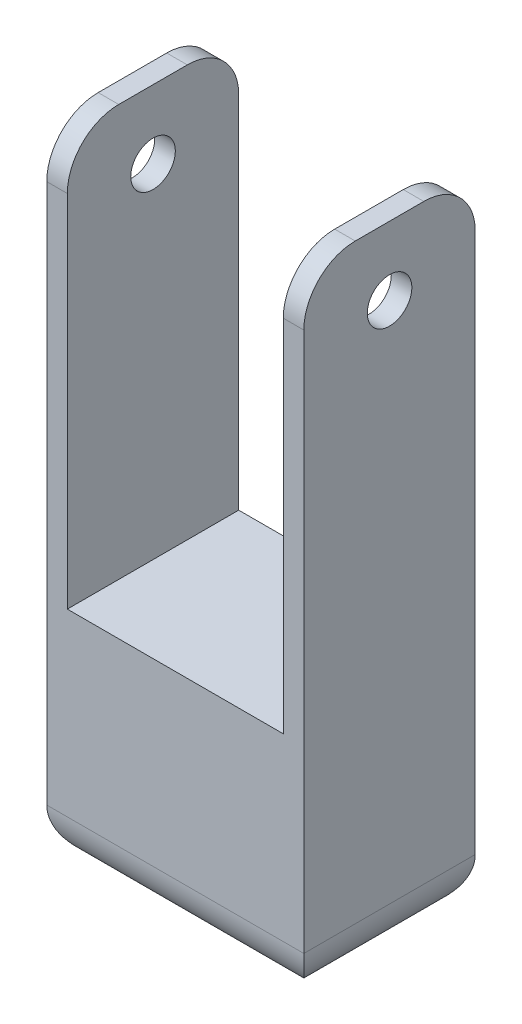
ISO-10303-21;
HEADER;
FILE_DESCRIPTION(('STEP AP214'),'2;1');
FILE_NAME('part.step','',(''),(''),'','','');
FILE_SCHEMA(('AUTOMOTIVE_DESIGN { 1 0 10303 214 1 1 1 1 }'));
ENDSEC;
DATA;
#1=APPLICATION_CONTEXT('core data for automotive mechanical design processes');
#2=APPLICATION_PROTOCOL_DEFINITION('international standard','automotive_design',2000,#1);
#3=PRODUCT_CONTEXT('',#1,'mechanical');
#4=PRODUCT('Part','Part','',(#3));
#5=PRODUCT_RELATED_PRODUCT_CATEGORY('part','',(#4));
#6=PRODUCT_DEFINITION_FORMATION('','',#4);
#7=PRODUCT_DEFINITION_CONTEXT('part definition',#1,'design');
#8=PRODUCT_DEFINITION('design','',#6,#7);
#9=PRODUCT_DEFINITION_SHAPE('','',#8);
#10=(LENGTH_UNIT() NAMED_UNIT(*) SI_UNIT(.MILLI.,.METRE.));
#11=(NAMED_UNIT(*) PLANE_ANGLE_UNIT() SI_UNIT($,.RADIAN.));
#12=(NAMED_UNIT(*) SI_UNIT($,.STERADIAN.) SOLID_ANGLE_UNIT());
#13=UNCERTAINTY_MEASURE_WITH_UNIT(LENGTH_MEASURE(1.E-05),#10,'distance_accuracy_value','');
#14=(GEOMETRIC_REPRESENTATION_CONTEXT(3) GLOBAL_UNCERTAINTY_ASSIGNED_CONTEXT((#13)) GLOBAL_UNIT_ASSIGNED_CONTEXT((#10,
#11,#12)) REPRESENTATION_CONTEXT('',''));
#15=CARTESIAN_POINT('',(0.,0.,0.));
#16=DIRECTION('',(0.,0.,1.));
#17=DIRECTION('',(1.,0.,0.));
#18=AXIS2_PLACEMENT_3D('',#15,#16,#17);
#19=CARTESIAN_POINT('',(0.,63.5,0.));
#20=DIRECTION('',(0.,1.,0.));
#21=DIRECTION('',(0.,0.,1.));
#22=AXIS2_PLACEMENT_3D('',#19,#20,#21);
#23=PLANE('',#22);
#24=DIRECTION('',(0.,0.,1.));
#25=VECTOR('',#24,1.);
#26=CARTESIAN_POINT('',(-19.05,63.5,-12.7));
#27=LINE('',#26,#25);
#28=CARTESIAN_POINT('',(-19.05,63.5,-5.08));
#29=VERTEX_POINT('',#28);
#30=CARTESIAN_POINT('',(-19.05,63.5,5.07999999999999));
#31=VERTEX_POINT('',#30);
#32=EDGE_CURVE('E187',#29,#31,#27,.T.);
#33=ORIENTED_EDGE('',*,*,#32,.T.);
#34=DIRECTION('',(1.,0.,0.));
#35=VECTOR('',#34,1.);
#36=CARTESIAN_POINT('',(-16.002,63.5,5.08));
#37=LINE('',#36,#35);
#38=CARTESIAN_POINT('',(-16.002,63.5,5.07999999999999));
#39=VERTEX_POINT('',#38);
#40=EDGE_CURVE('E227',#31,#39,#37,.T.);
#41=ORIENTED_EDGE('',*,*,#40,.T.);
#42=DIRECTION('',(0.,0.,1.));
#43=VECTOR('',#42,1.);
#44=CARTESIAN_POINT('',(-16.002,63.5,-12.7));
#45=LINE('',#44,#43);
#46=CARTESIAN_POINT('',(-16.002,63.5,-5.08));
#47=VERTEX_POINT('',#46);
#48=EDGE_CURVE('E173',#47,#39,#45,.T.);
#49=ORIENTED_EDGE('',*,*,#48,.F.);
#50=DIRECTION('',(-1.,0.,0.));
#51=VECTOR('',#50,1.);
#52=CARTESIAN_POINT('',(-19.05,63.5,-5.08));
#53=LINE('',#52,#51);
#54=EDGE_CURVE('E224',#47,#29,#53,.T.);
#55=ORIENTED_EDGE('',*,*,#54,.T.);
#56=EDGE_LOOP('',(#33,#41,#49,#55));
#57=FACE_BOUND('',#56,.T.);
#58=ADVANCED_FACE('F37',(#57),#23,.T.);
#59=CARTESIAN_POINT('',(19.05,63.5,-12.7));
#60=DIRECTION('',(-1.,0.,0.));
#61=DIRECTION('',(0.,0.,1.));
#62=AXIS2_PLACEMENT_3D('',#59,#60,#61);
#63=PLANE('',#62);
#64=CARTESIAN_POINT('',(19.05,53.34,0.));
#65=DIRECTION('',(-1.,0.,0.));
#66=DIRECTION('',(0.,0.,1.));
#67=AXIS2_PLACEMENT_3D('',#64,#65,#66);
#68=CIRCLE('',#67,3.302);
#69=CARTESIAN_POINT('',(19.05,53.34,3.302));
#70=VERTEX_POINT('',#69);
#71=EDGE_CURVE('E202',#70,#70,#68,.T.);
#72=ORIENTED_EDGE('',*,*,#71,.T.);
#73=EDGE_LOOP('',(#72));
#74=FACE_BOUND('',#73,.T.);
#75=DIRECTION('',(0.,-1.,0.));
#76=VECTOR('',#75,1.);
#77=CARTESIAN_POINT('',(19.05,63.5,12.7));
#78=LINE('',#77,#76);
#79=CARTESIAN_POINT('',(19.05,55.88,12.7));
#80=VERTEX_POINT('',#79);
#81=CARTESIAN_POINT('',(19.05,-24.13,12.7));
#82=VERTEX_POINT('',#81);
#83=EDGE_CURVE('E190',#80,#82,#78,.T.);
#84=ORIENTED_EDGE('',*,*,#83,.T.);
#85=DIRECTION('',(0.,0.,1.));
#86=VECTOR('',#85,1.);
#87=CARTESIAN_POINT('',(19.05,-24.13,-12.7));
#88=LINE('',#87,#86);
#89=CARTESIAN_POINT('',(19.05,-24.13,-12.7));
#90=VERTEX_POINT('',#89);
#91=EDGE_CURVE('E61',#82,#90,#88,.F.);
#92=ORIENTED_EDGE('',*,*,#91,.T.);
#93=DIRECTION('',(0.,-1.,0.));
#94=VECTOR('',#93,1.);
#95=CARTESIAN_POINT('',(19.05,63.5,-12.7));
#96=LINE('',#95,#94);
#97=CARTESIAN_POINT('',(19.05,55.88,-12.7));
#98=VERTEX_POINT('',#97);
#99=EDGE_CURVE('E196',#98,#90,#96,.T.);
#100=ORIENTED_EDGE('',*,*,#99,.F.);
#101=CARTESIAN_POINT('',(19.05,55.88,-5.08));
#102=DIRECTION('',(-1.,0.,0.));
#103=DIRECTION('',(0.,0.,1.));
#104=AXIS2_PLACEMENT_3D('',#101,#102,#103);
#105=CIRCLE('',#104,7.62);
#106=CARTESIAN_POINT('',(19.05,63.5,-5.08));
#107=VERTEX_POINT('',#106);
#108=EDGE_CURVE('E208',#98,#107,#105,.F.);
#109=ORIENTED_EDGE('',*,*,#108,.T.);
#110=DIRECTION('',(0.,0.,-1.));
#111=VECTOR('',#110,1.);
#112=CARTESIAN_POINT('',(19.05,63.5,-12.7));
#113=LINE('',#112,#111);
#114=CARTESIAN_POINT('',(19.05,63.5,5.07999999999999));
#115=VERTEX_POINT('',#114);
#116=EDGE_CURVE('E180',#115,#107,#113,.T.);
#117=ORIENTED_EDGE('',*,*,#116,.F.);
#118=CARTESIAN_POINT('',(19.05,55.88,5.08));
#119=DIRECTION('',(-1.,0.,0.));
#120=DIRECTION('',(0.,0.,1.));
#121=AXIS2_PLACEMENT_3D('',#118,#119,#120);
#122=CIRCLE('',#121,7.62);
#123=EDGE_CURVE('E210',#115,#80,#122,.F.);
#124=ORIENTED_EDGE('',*,*,#123,.T.);
#125=EDGE_LOOP('',(#84,#92,#100,#109,#117,#124));
#126=FACE_BOUND('',#125,.T.);
#127=ADVANCED_FACE('F291',(#74,#126),#63,.F.);
#128=CARTESIAN_POINT('',(-19.05,63.5,-12.7));
#129=DIRECTION('',(0.,0.,1.));
#130=DIRECTION('',(1.,0.,0.));
#131=AXIS2_PLACEMENT_3D('',#128,#129,#130);
#132=PLANE('',#131);
#133=ORIENTED_EDGE('',*,*,#99,.T.);
#134=DIRECTION('',(1.,0.,0.));
#135=VECTOR('',#134,1.);
#136=CARTESIAN_POINT('',(-19.05,-24.13,-12.7));
#137=LINE('',#136,#135);
#138=CARTESIAN_POINT('',(-19.05,-24.13,-12.7));
#139=VERTEX_POINT('',#138);
#140=EDGE_CURVE('E46',#90,#139,#137,.F.);
#141=ORIENTED_EDGE('',*,*,#140,.T.);
#142=DIRECTION('',(0.,-1.,0.));
#143=VECTOR('',#142,1.);
#144=CARTESIAN_POINT('',(-19.05,63.5,-12.7));
#145=LINE('',#144,#143);
#146=CARTESIAN_POINT('',(-19.05,55.88,-12.7));
#147=VERTEX_POINT('',#146);
#148=EDGE_CURVE('E194',#147,#139,#145,.T.);
#149=ORIENTED_EDGE('',*,*,#148,.F.);
#150=DIRECTION('',(-1.,0.,0.));
#151=VECTOR('',#150,1.);
#152=CARTESIAN_POINT('',(-16.002,55.88,-12.7));
#153=LINE('',#152,#151);
#154=CARTESIAN_POINT('',(-16.002,55.88,-12.7));
#155=VERTEX_POINT('',#154);
#156=EDGE_CURVE('E220',#147,#155,#153,.F.);
#157=ORIENTED_EDGE('',*,*,#156,.T.);
#158=DIRECTION('',(0.,1.,0.));
#159=VECTOR('',#158,1.);
#160=CARTESIAN_POINT('',(-16.002,2.53999999999999,-12.7));
#161=LINE('',#160,#159);
#162=CARTESIAN_POINT('',(-16.002,2.53999999999999,-12.7));
#163=VERTEX_POINT('',#162);
#164=EDGE_CURVE('E178',#163,#155,#161,.T.);
#165=ORIENTED_EDGE('',*,*,#164,.F.);
#166=DIRECTION('',(-1.,0.,0.));
#167=VECTOR('',#166,1.);
#168=CARTESIAN_POINT('',(-16.002,2.53999999999999,-12.7));
#169=LINE('',#168,#167);
#170=CARTESIAN_POINT('',(16.002,2.53999999999999,-12.7));
#171=VERTEX_POINT('',#170);
#172=EDGE_CURVE('E152',#171,#163,#169,.T.);
#173=ORIENTED_EDGE('',*,*,#172,.F.);
#174=DIRECTION('',(0.,1.,0.));
#175=VECTOR('',#174,1.);
#176=CARTESIAN_POINT('',(16.002,2.53999999999999,-12.7));
#177=LINE('',#176,#175);
#178=CARTESIAN_POINT('',(16.002,55.88,-12.7));
#179=VERTEX_POINT('',#178);
#180=EDGE_CURVE('E181',#171,#179,#177,.T.);
#181=ORIENTED_EDGE('',*,*,#180,.T.);
#182=DIRECTION('',(-1.,0.,0.));
#183=VECTOR('',#182,1.);
#184=CARTESIAN_POINT('',(19.05,55.88,-12.7));
#185=LINE('',#184,#183);
#186=EDGE_CURVE('E222',#179,#98,#185,.F.);
#187=ORIENTED_EDGE('',*,*,#186,.T.);
#188=EDGE_LOOP('',(#133,#141,#149,#157,#165,#173,#181,#187));
#189=FACE_BOUND('',#188,.T.);
#190=ADVANCED_FACE('F298',(#189),#132,.F.);
#191=CARTESIAN_POINT('',(-19.05,63.5,-12.7));
#192=DIRECTION('',(1.,0.,0.));
#193=DIRECTION('',(0.,0.,-1.));
#194=AXIS2_PLACEMENT_3D('',#191,#192,#193);
#195=PLANE('',#194);
#196=CARTESIAN_POINT('',(-19.05,53.34,0.));
#197=DIRECTION('',(-1.,0.,0.));
#198=DIRECTION('',(0.,0.,1.));
#199=AXIS2_PLACEMENT_3D('',#196,#197,#198);
#200=CIRCLE('',#199,3.302);
#201=CARTESIAN_POINT('',(-19.05,53.34,3.30200000000001));
#202=VERTEX_POINT('',#201);
#203=EDGE_CURVE('E261',#202,#202,#200,.T.);
#204=ORIENTED_EDGE('',*,*,#203,.F.);
#205=EDGE_LOOP('',(#204));
#206=FACE_BOUND('',#205,.T.);
#207=ORIENTED_EDGE('',*,*,#148,.T.);
#208=DIRECTION('',(0.,0.,-1.));
#209=VECTOR('',#208,1.);
#210=CARTESIAN_POINT('',(-19.05,-24.13,12.7));
#211=LINE('',#210,#209);
#212=CARTESIAN_POINT('',(-19.05,-24.13,12.7));
#213=VERTEX_POINT('',#212);
#214=EDGE_CURVE('E11',#139,#213,#211,.F.);
#215=ORIENTED_EDGE('',*,*,#214,.T.);
#216=DIRECTION('',(0.,-1.,0.));
#217=VECTOR('',#216,1.);
#218=CARTESIAN_POINT('',(-19.05,63.5,12.7));
#219=LINE('',#218,#217);
#220=CARTESIAN_POINT('',(-19.05,55.88,12.7));
#221=VERTEX_POINT('',#220);
#222=EDGE_CURVE('E192',#221,#213,#219,.T.);
#223=ORIENTED_EDGE('',*,*,#222,.F.);
#224=CARTESIAN_POINT('',(-19.05,55.88,5.08));
#225=DIRECTION('',(1.,0.,0.));
#226=DIRECTION('',(0.,0.,-1.));
#227=AXIS2_PLACEMENT_3D('',#224,#225,#226);
#228=CIRCLE('',#227,7.62);
#229=EDGE_CURVE('E235',#221,#31,#228,.F.);
#230=ORIENTED_EDGE('',*,*,#229,.T.);
#231=ORIENTED_EDGE('',*,*,#32,.F.);
#232=CARTESIAN_POINT('',(-19.05,55.88,-5.08));
#233=DIRECTION('',(1.,0.,0.));
#234=DIRECTION('',(0.,0.,-1.));
#235=AXIS2_PLACEMENT_3D('',#232,#233,#234);
#236=CIRCLE('',#235,7.62);
#237=EDGE_CURVE('E233',#29,#147,#236,.F.);
#238=ORIENTED_EDGE('',*,*,#237,.T.);
#239=EDGE_LOOP('',(#207,#215,#223,#230,#231,#238));
#240=FACE_BOUND('',#239,.T.);
#241=ADVANCED_FACE('F310',(#206,#240),#195,.F.);
#242=CARTESIAN_POINT('',(-19.05,63.5,12.7));
#243=DIRECTION('',(0.,0.,-1.));
#244=DIRECTION('',(-1.,0.,0.));
#245=AXIS2_PLACEMENT_3D('',#242,#243,#244);
#246=PLANE('',#245);
#247=ORIENTED_EDGE('',*,*,#222,.T.);
#248=DIRECTION('',(-1.,0.,0.));
#249=VECTOR('',#248,1.);
#250=CARTESIAN_POINT('',(19.05,-24.13,12.7));
#251=LINE('',#250,#249);
#252=EDGE_CURVE('E246',#213,#82,#251,.F.);
#253=ORIENTED_EDGE('',*,*,#252,.T.);
#254=ORIENTED_EDGE('',*,*,#83,.F.);
#255=DIRECTION('',(1.,0.,0.));
#256=VECTOR('',#255,1.);
#257=CARTESIAN_POINT('',(16.002,55.88,12.7));
#258=LINE('',#257,#256);
#259=CARTESIAN_POINT('',(16.002,55.88,12.7));
#260=VERTEX_POINT('',#259);
#261=EDGE_CURVE('E214',#80,#260,#258,.F.);
#262=ORIENTED_EDGE('',*,*,#261,.T.);
#263=DIRECTION('',(0.,1.,0.));
#264=VECTOR('',#263,1.);
#265=CARTESIAN_POINT('',(16.002,2.53999999999999,12.7));
#266=LINE('',#265,#264);
#267=CARTESIAN_POINT('',(16.002,2.53999999999999,12.7));
#268=VERTEX_POINT('',#267);
#269=EDGE_CURVE('E151',#268,#260,#266,.T.);
#270=ORIENTED_EDGE('',*,*,#269,.F.);
#271=DIRECTION('',(1.,0.,0.));
#272=VECTOR('',#271,1.);
#273=CARTESIAN_POINT('',(-16.002,2.53999999999999,12.7));
#274=LINE('',#273,#272);
#275=CARTESIAN_POINT('',(-16.002,2.53999999999999,12.7));
#276=VERTEX_POINT('',#275);
#277=EDGE_CURVE('E158',#276,#268,#274,.T.);
#278=ORIENTED_EDGE('',*,*,#277,.F.);
#279=DIRECTION('',(0.,1.,0.));
#280=VECTOR('',#279,1.);
#281=CARTESIAN_POINT('',(-16.002,2.53999999999999,12.7));
#282=LINE('',#281,#280);
#283=CARTESIAN_POINT('',(-16.002,55.88,12.7));
#284=VERTEX_POINT('',#283);
#285=EDGE_CURVE('E140',#276,#284,#282,.T.);
#286=ORIENTED_EDGE('',*,*,#285,.T.);
#287=DIRECTION('',(1.,0.,0.));
#288=VECTOR('',#287,1.);
#289=CARTESIAN_POINT('',(-19.05,55.88,12.7));
#290=LINE('',#289,#288);
#291=EDGE_CURVE('E212',#284,#221,#290,.F.);
#292=ORIENTED_EDGE('',*,*,#291,.T.);
#293=EDGE_LOOP('',(#247,#253,#254,#262,#270,#278,#286,#292));
#294=FACE_BOUND('',#293,.T.);
#295=ADVANCED_FACE('F165',(#294),#246,.F.);
#296=DIRECTION('',(0.,0.,-1.));
#297=VECTOR('',#296,1.);
#298=CARTESIAN_POINT('',(16.002,63.5,-12.7));
#299=LINE('',#298,#297);
#300=CARTESIAN_POINT('',(16.002,63.5,5.07999999999999));
#301=VERTEX_POINT('',#300);
#302=CARTESIAN_POINT('',(16.002,63.5,-5.08));
#303=VERTEX_POINT('',#302);
#304=EDGE_CURVE('E162',#301,#303,#299,.T.);
#305=ORIENTED_EDGE('',*,*,#304,.F.);
#306=DIRECTION('',(1.,0.,0.));
#307=VECTOR('',#306,1.);
#308=CARTESIAN_POINT('',(19.05,63.5,5.08));
#309=LINE('',#308,#307);
#310=EDGE_CURVE('E205',#301,#115,#309,.T.);
#311=ORIENTED_EDGE('',*,*,#310,.T.);
#312=ORIENTED_EDGE('',*,*,#116,.T.);
#313=DIRECTION('',(-1.,0.,0.));
#314=VECTOR('',#313,1.);
#315=CARTESIAN_POINT('',(16.002,63.5,-5.08));
#316=LINE('',#315,#314);
#317=EDGE_CURVE('E198',#107,#303,#316,.T.);
#318=ORIENTED_EDGE('',*,*,#317,.T.);
#319=EDGE_LOOP('',(#305,#311,#312,#318));
#320=FACE_BOUND('',#319,.T.);
#321=ADVANCED_FACE('F294',(#320),#23,.T.);
#322=CARTESIAN_POINT('',(-16.002,2.53999999999999,-12.7));
#323=DIRECTION('',(-1.,0.,0.));
#324=DIRECTION('',(0.,0.,1.));
#325=AXIS2_PLACEMENT_3D('',#322,#323,#324);
#326=PLANE('',#325);
#327=CARTESIAN_POINT('',(-16.002,53.34,0.));
#328=DIRECTION('',(-1.,0.,0.));
#329=DIRECTION('',(0.,0.,1.));
#330=AXIS2_PLACEMENT_3D('',#327,#328,#329);
#331=CIRCLE('',#330,3.302);
#332=CARTESIAN_POINT('',(-16.002,53.34,3.30200000000001));
#333=VERTEX_POINT('',#332);
#334=EDGE_CURVE('E175',#333,#333,#331,.T.);
#335=ORIENTED_EDGE('',*,*,#334,.T.);
#336=EDGE_LOOP('',(#335));
#337=FACE_BOUND('',#336,.T.);
#338=ORIENTED_EDGE('',*,*,#48,.T.);
#339=CARTESIAN_POINT('',(-16.002,55.88,5.08));
#340=DIRECTION('',(-1.,0.,0.));
#341=DIRECTION('',(0.,0.,1.));
#342=AXIS2_PLACEMENT_3D('',#339,#340,#341);
#343=CIRCLE('',#342,7.62);
#344=EDGE_CURVE('E147',#39,#284,#343,.F.);
#345=ORIENTED_EDGE('',*,*,#344,.T.);
#346=ORIENTED_EDGE('',*,*,#285,.F.);
#347=DIRECTION('',(0.,0.,1.));
#348=VECTOR('',#347,1.);
#349=CARTESIAN_POINT('',(-16.002,2.53999999999999,-12.7));
#350=LINE('',#349,#348);
#351=EDGE_CURVE('E145',#163,#276,#350,.T.);
#352=ORIENTED_EDGE('',*,*,#351,.F.);
#353=ORIENTED_EDGE('',*,*,#164,.T.);
#354=CARTESIAN_POINT('',(-16.002,55.88,-5.08));
#355=DIRECTION('',(-1.,0.,0.));
#356=DIRECTION('',(0.,0.,1.));
#357=AXIS2_PLACEMENT_3D('',#354,#355,#356);
#358=CIRCLE('',#357,7.62);
#359=EDGE_CURVE('E230',#155,#47,#358,.F.);
#360=ORIENTED_EDGE('',*,*,#359,.T.);
#361=EDGE_LOOP('',(#338,#345,#346,#352,#353,#360));
#362=FACE_BOUND('',#361,.T.);
#363=ADVANCED_FACE('F143',(#337,#362),#326,.F.);
#364=CARTESIAN_POINT('',(16.002,2.53999999999999,-12.7));
#365=DIRECTION('',(1.,0.,0.));
#366=DIRECTION('',(0.,0.,-1.));
#367=AXIS2_PLACEMENT_3D('',#364,#365,#366);
#368=PLANE('',#367);
#369=CARTESIAN_POINT('',(16.002,53.34,0.));
#370=DIRECTION('',(1.,0.,0.));
#371=DIRECTION('',(0.,0.,-1.));
#372=AXIS2_PLACEMENT_3D('',#369,#370,#371);
#373=CIRCLE('',#372,3.302);
#374=CARTESIAN_POINT('',(16.002,53.34,-3.30200000000001));
#375=VERTEX_POINT('',#374);
#376=EDGE_CURVE('E199',#375,#375,#373,.T.);
#377=ORIENTED_EDGE('',*,*,#376,.T.);
#378=EDGE_LOOP('',(#377));
#379=FACE_BOUND('',#378,.T.);
#380=ORIENTED_EDGE('',*,*,#269,.T.);
#381=CARTESIAN_POINT('',(16.002,55.88,5.08));
#382=DIRECTION('',(1.,0.,0.));
#383=DIRECTION('',(0.,0.,-1.));
#384=AXIS2_PLACEMENT_3D('',#381,#382,#383);
#385=CIRCLE('',#384,7.62);
#386=EDGE_CURVE('E218',#260,#301,#385,.F.);
#387=ORIENTED_EDGE('',*,*,#386,.T.);
#388=ORIENTED_EDGE('',*,*,#304,.T.);
#389=CARTESIAN_POINT('',(16.002,55.88,-5.08));
#390=DIRECTION('',(1.,0.,0.));
#391=DIRECTION('',(0.,0.,-1.));
#392=AXIS2_PLACEMENT_3D('',#389,#390,#391);
#393=CIRCLE('',#392,7.62);
#394=EDGE_CURVE('E216',#303,#179,#393,.F.);
#395=ORIENTED_EDGE('',*,*,#394,.T.);
#396=ORIENTED_EDGE('',*,*,#180,.F.);
#397=DIRECTION('',(0.,0.,-1.));
#398=VECTOR('',#397,1.);
#399=CARTESIAN_POINT('',(16.002,2.53999999999999,-12.7));
#400=LINE('',#399,#398);
#401=EDGE_CURVE('E167',#268,#171,#400,.T.);
#402=ORIENTED_EDGE('',*,*,#401,.F.);
#403=EDGE_LOOP('',(#380,#387,#388,#395,#396,#402));
#404=FACE_BOUND('',#403,.T.);
#405=ADVANCED_FACE('F309',(#379,#404),#368,.F.);
#406=CARTESIAN_POINT('',(0.,2.53999999999999,0.));
#407=DIRECTION('',(0.,1.,0.));
#408=DIRECTION('',(0.,0.,1.));
#409=AXIS2_PLACEMENT_3D('',#406,#407,#408);
#410=PLANE('',#409);
#411=ORIENTED_EDGE('',*,*,#351,.T.);
#412=ORIENTED_EDGE('',*,*,#277,.T.);
#413=ORIENTED_EDGE('',*,*,#401,.T.);
#414=ORIENTED_EDGE('',*,*,#172,.T.);
#415=EDGE_LOOP('',(#411,#412,#413,#414));
#416=FACE_BOUND('',#415,.T.);
#417=ADVANCED_FACE('F156',(#416),#410,.T.);
#418=CARTESIAN_POINT('',(19.05,53.34,0.));
#419=DIRECTION('',(-1.,0.,0.));
#420=DIRECTION('',(0.,0.,1.));
#421=AXIS2_PLACEMENT_3D('',#418,#419,#420);
#422=CYLINDRICAL_SURFACE('',#421,3.302);
#423=ORIENTED_EDGE('',*,*,#71,.F.);
#424=EDGE_LOOP('',(#423));
#425=FACE_BOUND('',#424,.T.);
#426=ORIENTED_EDGE('',*,*,#376,.F.);
#427=EDGE_LOOP('',(#426));
#428=FACE_BOUND('',#427,.T.);
#429=ADVANCED_FACE('F278',(#425,#428),#422,.F.);
#430=ORIENTED_EDGE('',*,*,#203,.T.);
#431=EDGE_LOOP('',(#430));
#432=FACE_BOUND('',#431,.T.);
#433=ORIENTED_EDGE('',*,*,#334,.F.);
#434=EDGE_LOOP('',(#433));
#435=FACE_BOUND('',#434,.T.);
#436=ADVANCED_FACE('F275',(#432,#435),#422,.F.);
#437=CARTESIAN_POINT('',(0.,55.88,5.08));
#438=DIRECTION('',(-1.,0.,0.));
#439=DIRECTION('',(0.,0.,1.));
#440=AXIS2_PLACEMENT_3D('',#437,#438,#439);
#441=CYLINDRICAL_SURFACE('',#440,7.62);
#442=ORIENTED_EDGE('',*,*,#386,.F.);
#443=ORIENTED_EDGE('',*,*,#261,.F.);
#444=ORIENTED_EDGE('',*,*,#123,.F.);
#445=ORIENTED_EDGE('',*,*,#310,.F.);
#446=EDGE_LOOP('',(#442,#443,#444,#445));
#447=FACE_BOUND('',#446,.T.);
#448=ADVANCED_FACE('F277',(#447),#441,.T.);
#449=CARTESIAN_POINT('',(0.,55.88,-5.08));
#450=DIRECTION('',(1.,0.,0.));
#451=DIRECTION('',(0.,0.,-1.));
#452=AXIS2_PLACEMENT_3D('',#449,#450,#451);
#453=CYLINDRICAL_SURFACE('',#452,7.62);
#454=ORIENTED_EDGE('',*,*,#108,.F.);
#455=ORIENTED_EDGE('',*,*,#186,.F.);
#456=ORIENTED_EDGE('',*,*,#394,.F.);
#457=ORIENTED_EDGE('',*,*,#317,.F.);
#458=EDGE_LOOP('',(#454,#455,#456,#457));
#459=FACE_BOUND('',#458,.T.);
#460=ADVANCED_FACE('F284',(#459),#453,.T.);
#461=CARTESIAN_POINT('',(0.,55.88,5.08));
#462=DIRECTION('',(-1.,0.,0.));
#463=DIRECTION('',(0.,0.,1.));
#464=AXIS2_PLACEMENT_3D('',#461,#462,#463);
#465=CYLINDRICAL_SURFACE('',#464,7.62);
#466=ORIENTED_EDGE('',*,*,#229,.F.);
#467=ORIENTED_EDGE('',*,*,#291,.F.);
#468=ORIENTED_EDGE('',*,*,#344,.F.);
#469=ORIENTED_EDGE('',*,*,#40,.F.);
#470=EDGE_LOOP('',(#466,#467,#468,#469));
#471=FACE_BOUND('',#470,.T.);
#472=ADVANCED_FACE('F344',(#471),#465,.T.);
#473=CARTESIAN_POINT('',(0.,55.88,-5.08));
#474=DIRECTION('',(1.,0.,0.));
#475=DIRECTION('',(0.,0.,-1.));
#476=AXIS2_PLACEMENT_3D('',#473,#474,#475);
#477=CYLINDRICAL_SURFACE('',#476,7.62);
#478=ORIENTED_EDGE('',*,*,#359,.F.);
#479=ORIENTED_EDGE('',*,*,#156,.F.);
#480=ORIENTED_EDGE('',*,*,#237,.F.);
#481=ORIENTED_EDGE('',*,*,#54,.F.);
#482=EDGE_LOOP('',(#478,#479,#480,#481));
#483=FACE_BOUND('',#482,.T.);
#484=ADVANCED_FACE('F341',(#483),#477,.T.);
#485=CARTESIAN_POINT('',(0.,-31.75,0.));
#486=DIRECTION('',(0.,-1.,0.));
#487=DIRECTION('',(0.,0.,-1.));
#488=AXIS2_PLACEMENT_3D('',#485,#486,#487);
#489=PLANE('',#488);
#490=DIRECTION('',(0.,0.,1.));
#491=VECTOR('',#490,1.);
#492=CARTESIAN_POINT('',(11.43,-31.75,12.7));
#493=LINE('',#492,#491);
#494=CARTESIAN_POINT('',(11.43,-31.75,-5.08));
#495=VERTEX_POINT('',#494);
#496=CARTESIAN_POINT('',(11.43,-31.75,5.08));
#497=VERTEX_POINT('',#496);
#498=EDGE_CURVE('E241',#495,#497,#493,.T.);
#499=ORIENTED_EDGE('',*,*,#498,.T.);
#500=DIRECTION('',(-1.,0.,0.));
#501=VECTOR('',#500,1.);
#502=CARTESIAN_POINT('',(-19.05,-31.75,5.08));
#503=LINE('',#502,#501);
#504=CARTESIAN_POINT('',(-11.43,-31.75,5.08));
#505=VERTEX_POINT('',#504);
#506=EDGE_CURVE('E243',#497,#505,#503,.T.);
#507=ORIENTED_EDGE('',*,*,#506,.T.);
#508=DIRECTION('',(0.,0.,-1.));
#509=VECTOR('',#508,1.);
#510=CARTESIAN_POINT('',(-11.43,-31.75,-12.7));
#511=LINE('',#510,#509);
#512=CARTESIAN_POINT('',(-11.43,-31.75,-5.08));
#513=VERTEX_POINT('',#512);
#514=EDGE_CURVE('E237',#505,#513,#511,.T.);
#515=ORIENTED_EDGE('',*,*,#514,.T.);
#516=DIRECTION('',(1.,0.,0.));
#517=VECTOR('',#516,1.);
#518=CARTESIAN_POINT('',(19.05,-31.75,-5.08));
#519=LINE('',#518,#517);
#520=EDGE_CURVE('E239',#513,#495,#519,.T.);
#521=ORIENTED_EDGE('',*,*,#520,.T.);
#522=EDGE_LOOP('',(#499,#507,#515,#521));
#523=FACE_BOUND('',#522,.T.);
#524=ADVANCED_FACE('F329',(#523),#489,.T.);
#525=CARTESIAN_POINT('',(0.,-24.13,-5.08));
#526=DIRECTION('',(-1.,0.,0.));
#527=DIRECTION('',(0.,0.,1.));
#528=AXIS2_PLACEMENT_3D('',#525,#526,#527);
#529=CYLINDRICAL_SURFACE('',#528,7.62);
#530=CARTESIAN_POINT('',(-11.43,-24.13,-5.08));
#531=DIRECTION('',(-0.707106781186547,0.,0.707106781186548));
#532=DIRECTION('',(0.707106781186548,0.,0.707106781186547));
#533=AXIS2_PLACEMENT_3D('',#530,#531,#532);
#534=ELLIPSE('',#533,10.776307345283,7.62);
#535=EDGE_CURVE('E254',#139,#513,#534,.T.);
#536=ORIENTED_EDGE('',*,*,#535,.F.);
#537=ORIENTED_EDGE('',*,*,#140,.F.);
#538=CARTESIAN_POINT('',(11.43,-24.13,-5.08));
#539=DIRECTION('',(-0.707106781186548,0.,-0.707106781186547));
#540=DIRECTION('',(-0.707106781186547,0.,0.707106781186548));
#541=AXIS2_PLACEMENT_3D('',#538,#539,#540);
#542=ELLIPSE('',#541,10.776307345283,7.62);
#543=EDGE_CURVE('E41',#495,#90,#542,.F.);
#544=ORIENTED_EDGE('',*,*,#543,.F.);
#545=ORIENTED_EDGE('',*,*,#520,.F.);
#546=EDGE_LOOP('',(#536,#537,#544,#545));
#547=FACE_BOUND('',#546,.T.);
#548=ADVANCED_FACE('F39',(#547),#529,.T.);
#549=CARTESIAN_POINT('',(11.43,-24.13,0.));
#550=DIRECTION('',(0.,0.,-1.));
#551=DIRECTION('',(-1.,0.,0.));
#552=AXIS2_PLACEMENT_3D('',#549,#550,#551);
#553=CYLINDRICAL_SURFACE('',#552,7.62);
#554=ORIENTED_EDGE('',*,*,#543,.T.);
#555=ORIENTED_EDGE('',*,*,#91,.F.);
#556=CARTESIAN_POINT('',(11.43,-24.13,5.08));
#557=DIRECTION('',(0.707106781186547,0.,-0.707106781186548));
#558=DIRECTION('',(-0.707106781186548,0.,-0.707106781186547));
#559=AXIS2_PLACEMENT_3D('',#556,#557,#558);
#560=ELLIPSE('',#559,10.776307345283,7.62);
#561=EDGE_CURVE('E253',#497,#82,#560,.F.);
#562=ORIENTED_EDGE('',*,*,#561,.F.);
#563=ORIENTED_EDGE('',*,*,#498,.F.);
#564=EDGE_LOOP('',(#554,#555,#562,#563));
#565=FACE_BOUND('',#564,.T.);
#566=ADVANCED_FACE('F330',(#565),#553,.T.);
#567=CARTESIAN_POINT('',(-11.43,-24.13,0.));
#568=DIRECTION('',(0.,0.,1.));
#569=DIRECTION('',(1.,0.,0.));
#570=AXIS2_PLACEMENT_3D('',#567,#568,#569);
#571=CYLINDRICAL_SURFACE('',#570,7.62);
#572=ORIENTED_EDGE('',*,*,#535,.T.);
#573=ORIENTED_EDGE('',*,*,#514,.F.);
#574=CARTESIAN_POINT('',(-11.43,-24.13,5.08));
#575=DIRECTION('',(0.707106781186548,0.,0.707106781186547));
#576=DIRECTION('',(-0.707106781186547,0.,0.707106781186548));
#577=AXIS2_PLACEMENT_3D('',#574,#575,#576);
#578=ELLIPSE('',#577,10.776307345283,7.62);
#579=EDGE_CURVE('E251',#213,#505,#578,.T.);
#580=ORIENTED_EDGE('',*,*,#579,.F.);
#581=ORIENTED_EDGE('',*,*,#214,.F.);
#582=EDGE_LOOP('',(#572,#573,#580,#581));
#583=FACE_BOUND('',#582,.T.);
#584=ADVANCED_FACE('F326',(#583),#571,.T.);
#585=CARTESIAN_POINT('',(0.,-24.13,5.08));
#586=DIRECTION('',(1.,0.,0.));
#587=DIRECTION('',(0.,0.,-1.));
#588=AXIS2_PLACEMENT_3D('',#585,#586,#587);
#589=CYLINDRICAL_SURFACE('',#588,7.62);
#590=ORIENTED_EDGE('',*,*,#561,.T.);
#591=ORIENTED_EDGE('',*,*,#252,.F.);
#592=ORIENTED_EDGE('',*,*,#579,.T.);
#593=ORIENTED_EDGE('',*,*,#506,.F.);
#594=EDGE_LOOP('',(#590,#591,#592,#593));
#595=FACE_BOUND('',#594,.T.);
#596=ADVANCED_FACE('F323',(#595),#589,.T.);
#597=CLOSED_SHELL('',(#58,#127,#190,#241,#295,#321,#363,#405,#417,#429,#436,#448,#460,#472,#484,
#524,#548,#566,#584,#596));
#598=MANIFOLD_SOLID_BREP('B2',#597);
#599=ADVANCED_BREP_SHAPE_REPRESENTATION('',(#18,#598),#14);
#600=SHAPE_DEFINITION_REPRESENTATION(#9,#599);
ENDSEC;
END-ISO-10303-21;
